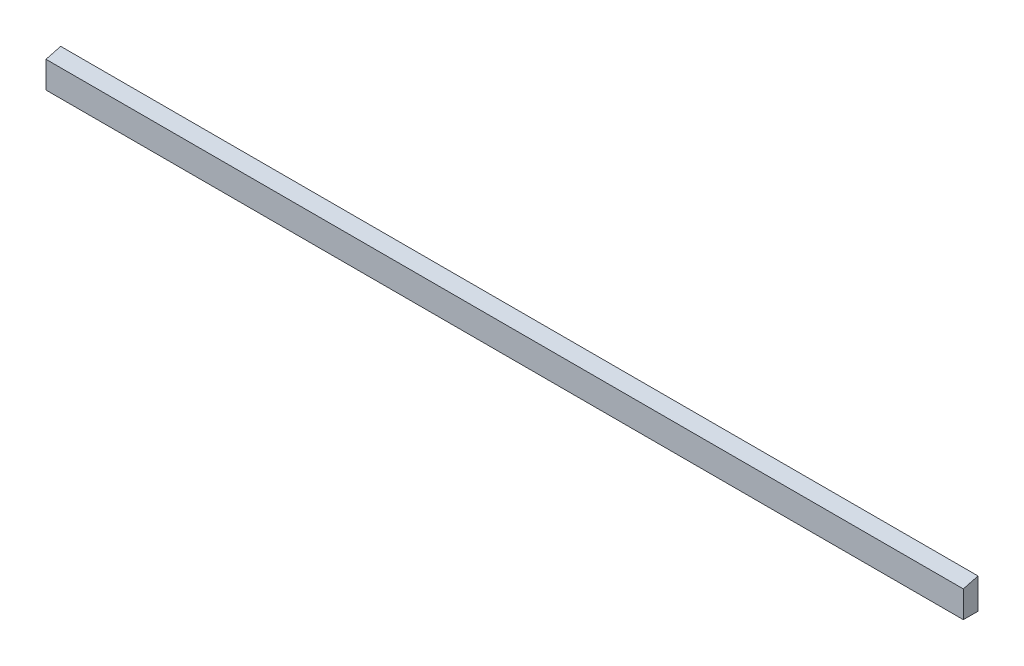
ISO-10303-21;
HEADER;
FILE_DESCRIPTION(('STEP AP214'),'2;1');
FILE_NAME('part.step','',(''),(''),'','','');
FILE_SCHEMA(('AUTOMOTIVE_DESIGN { 1 0 10303 214 1 1 1 1 }'));
ENDSEC;
DATA;
#1=APPLICATION_CONTEXT('core data for automotive mechanical design processes');
#2=APPLICATION_PROTOCOL_DEFINITION('international standard','automotive_design',2000,#1);
#3=PRODUCT_CONTEXT('',#1,'mechanical');
#4=PRODUCT('Part','Part','',(#3));
#5=PRODUCT_RELATED_PRODUCT_CATEGORY('part','',(#4));
#6=PRODUCT_DEFINITION_FORMATION('','',#4);
#7=PRODUCT_DEFINITION_CONTEXT('part definition',#1,'design');
#8=PRODUCT_DEFINITION('design','',#6,#7);
#9=PRODUCT_DEFINITION_SHAPE('','',#8);
#10=(LENGTH_UNIT() NAMED_UNIT(*) SI_UNIT(.MILLI.,.METRE.));
#11=(NAMED_UNIT(*) PLANE_ANGLE_UNIT() SI_UNIT($,.RADIAN.));
#12=(NAMED_UNIT(*) SI_UNIT($,.STERADIAN.) SOLID_ANGLE_UNIT());
#13=UNCERTAINTY_MEASURE_WITH_UNIT(LENGTH_MEASURE(1.E-05),#10,'distance_accuracy_value','');
#14=(GEOMETRIC_REPRESENTATION_CONTEXT(3) GLOBAL_UNCERTAINTY_ASSIGNED_CONTEXT((#13)) GLOBAL_UNIT_ASSIGNED_CONTEXT((#10,
#11,#12)) REPRESENTATION_CONTEXT('',''));
#15=CARTESIAN_POINT('',(0.,0.,0.));
#16=DIRECTION('',(0.,0.,1.));
#17=DIRECTION('',(1.,0.,0.));
#18=AXIS2_PLACEMENT_3D('',#15,#16,#17);
#19=CARTESIAN_POINT('',(1143.,38.1,0.));
#20=DIRECTION('',(0.,0.,1.));
#21=DIRECTION('',(0.,-1.,0.));
#22=AXIS2_PLACEMENT_3D('',#19,#20,#21);
#23=PLANE('',#22);
#24=DIRECTION('',(0.,1.,0.));
#25=VECTOR('',#24,1.);
#26=CARTESIAN_POINT('',(0.,38.1,0.));
#27=LINE('',#26,#25);
#28=CARTESIAN_POINT('',(0.,0.,0.));
#29=VERTEX_POINT('',#28);
#30=CARTESIAN_POINT('',(0.,38.1,0.));
#31=VERTEX_POINT('',#30);
#32=EDGE_CURVE('E93',#29,#31,#27,.T.);
#33=ORIENTED_EDGE('',*,*,#32,.T.);
#34=DIRECTION('',(-1.,0.,0.));
#35=VECTOR('',#34,1.);
#36=CARTESIAN_POINT('',(1143.,38.1,0.));
#37=LINE('',#36,#35);
#38=CARTESIAN_POINT('',(1143.,38.1,0.));
#39=VERTEX_POINT('',#38);
#40=EDGE_CURVE('E11',#39,#31,#37,.T.);
#41=ORIENTED_EDGE('',*,*,#40,.F.);
#42=DIRECTION('',(0.,1.,0.));
#43=VECTOR('',#42,1.);
#44=CARTESIAN_POINT('',(1143.,38.1,0.));
#45=LINE('',#44,#43);
#46=CARTESIAN_POINT('',(1143.,0.,0.));
#47=VERTEX_POINT('',#46);
#48=EDGE_CURVE('E81',#47,#39,#45,.T.);
#49=ORIENTED_EDGE('',*,*,#48,.F.);
#50=DIRECTION('',(-1.,0.,0.));
#51=VECTOR('',#50,1.);
#52=CARTESIAN_POINT('',(1143.,0.,0.));
#53=LINE('',#52,#51);
#54=EDGE_CURVE('E89',#47,#29,#53,.T.);
#55=ORIENTED_EDGE('',*,*,#54,.T.);
#56=EDGE_LOOP('',(#33,#41,#49,#55));
#57=FACE_BOUND('',#56,.T.);
#58=ADVANCED_FACE('F30',(#57),#23,.F.);
#59=CARTESIAN_POINT('',(1143.,33.2082525556792,18.25625));
#60=DIRECTION('',(0.,-0.965925826289067,-0.258819045102525));
#61=DIRECTION('',(0.,0.258819045102525,-0.965925826289067));
#62=AXIS2_PLACEMENT_3D('',#59,#60,#61);
#63=PLANE('',#62);
#64=DIRECTION('',(0.,-0.258819045102525,0.965925826289067));
#65=VECTOR('',#64,1.);
#66=CARTESIAN_POINT('',(0.,33.2082525556792,18.2562499999998));
#67=LINE('',#66,#65);
#68=CARTESIAN_POINT('',(0.,33.2082525556792,18.2562499999998));
#69=VERTEX_POINT('',#68);
#70=EDGE_CURVE('E85',#31,#69,#67,.T.);
#71=ORIENTED_EDGE('',*,*,#70,.T.);
#72=DIRECTION('',(-1.,0.,0.));
#73=VECTOR('',#72,1.);
#74=CARTESIAN_POINT('',(1143.,33.2082525556792,18.25625));
#75=LINE('',#74,#73);
#76=CARTESIAN_POINT('',(1143.,33.2082525556792,18.25625));
#77=VERTEX_POINT('',#76);
#78=EDGE_CURVE('E38',#77,#69,#75,.T.);
#79=ORIENTED_EDGE('',*,*,#78,.F.);
#80=DIRECTION('',(0.,-0.258819045102525,0.965925826289067));
#81=VECTOR('',#80,1.);
#82=CARTESIAN_POINT('',(1143.,33.2082525556792,18.25625));
#83=LINE('',#82,#81);
#84=EDGE_CURVE('E76',#39,#77,#83,.T.);
#85=ORIENTED_EDGE('',*,*,#84,.F.);
#86=ORIENTED_EDGE('',*,*,#40,.T.);
#87=EDGE_LOOP('',(#71,#79,#85,#86));
#88=FACE_BOUND('',#87,.T.);
#89=ADVANCED_FACE('F84',(#88),#63,.F.);
#90=CARTESIAN_POINT('',(1143.,0.,18.2562499999998));
#91=DIRECTION('',(0.,0.,-1.));
#92=DIRECTION('',(-1.,0.,0.));
#93=AXIS2_PLACEMENT_3D('',#90,#91,#92);
#94=PLANE('',#93);
#95=DIRECTION('',(0.,-1.,0.));
#96=VECTOR('',#95,1.);
#97=CARTESIAN_POINT('',(0.,0.,18.2562499999997));
#98=LINE('',#97,#96);
#99=CARTESIAN_POINT('',(0.,0.,18.2562499999997));
#100=VERTEX_POINT('',#99);
#101=EDGE_CURVE('E63',#69,#100,#98,.T.);
#102=ORIENTED_EDGE('',*,*,#101,.T.);
#103=DIRECTION('',(-1.,0.,0.));
#104=VECTOR('',#103,1.);
#105=CARTESIAN_POINT('',(1143.,0.,18.2562499999998));
#106=LINE('',#105,#104);
#107=CARTESIAN_POINT('',(1143.,0.,18.2562499999998));
#108=VERTEX_POINT('',#107);
#109=EDGE_CURVE('E86',#108,#100,#106,.T.);
#110=ORIENTED_EDGE('',*,*,#109,.F.);
#111=DIRECTION('',(0.,-1.,0.));
#112=VECTOR('',#111,1.);
#113=CARTESIAN_POINT('',(1143.,0.,18.2562499999998));
#114=LINE('',#113,#112);
#115=EDGE_CURVE('E79',#77,#108,#114,.T.);
#116=ORIENTED_EDGE('',*,*,#115,.F.);
#117=ORIENTED_EDGE('',*,*,#78,.T.);
#118=EDGE_LOOP('',(#102,#110,#116,#117));
#119=FACE_BOUND('',#118,.T.);
#120=ADVANCED_FACE('F87',(#119),#94,.F.);
#121=CARTESIAN_POINT('',(1143.,0.,0.));
#122=DIRECTION('',(0.,1.,0.));
#123=DIRECTION('',(0.,0.,1.));
#124=AXIS2_PLACEMENT_3D('',#121,#122,#123);
#125=PLANE('',#124);
#126=DIRECTION('',(0.,0.,-1.));
#127=VECTOR('',#126,1.);
#128=CARTESIAN_POINT('',(0.,0.,0.));
#129=LINE('',#128,#127);
#130=EDGE_CURVE('E69',#100,#29,#129,.T.);
#131=ORIENTED_EDGE('',*,*,#130,.T.);
#132=ORIENTED_EDGE('',*,*,#54,.F.);
#133=DIRECTION('',(0.,0.,-1.));
#134=VECTOR('',#133,1.);
#135=CARTESIAN_POINT('',(1143.,0.,0.));
#136=LINE('',#135,#134);
#137=EDGE_CURVE('E46',#108,#47,#136,.T.);
#138=ORIENTED_EDGE('',*,*,#137,.F.);
#139=ORIENTED_EDGE('',*,*,#109,.T.);
#140=EDGE_LOOP('',(#131,#132,#138,#139));
#141=FACE_BOUND('',#140,.T.);
#142=ADVANCED_FACE('F100',(#141),#125,.F.);
#143=CARTESIAN_POINT('',(1143.,0.,0.));
#144=DIRECTION('',(-1.,0.,0.));
#145=DIRECTION('',(0.,0.,1.));
#146=AXIS2_PLACEMENT_3D('',#143,#144,#145);
#147=PLANE('',#146);
#148=ORIENTED_EDGE('',*,*,#48,.T.);
#149=ORIENTED_EDGE('',*,*,#84,.T.);
#150=ORIENTED_EDGE('',*,*,#115,.T.);
#151=ORIENTED_EDGE('',*,*,#137,.T.);
#152=EDGE_LOOP('',(#148,#149,#150,#151));
#153=FACE_BOUND('',#152,.T.);
#154=ADVANCED_FACE('F77',(#153),#147,.F.);
#155=CARTESIAN_POINT('',(0.,0.,0.));
#156=DIRECTION('',(-1.,0.,0.));
#157=DIRECTION('',(0.,0.,1.));
#158=AXIS2_PLACEMENT_3D('',#155,#156,#157);
#159=PLANE('',#158);
#160=ORIENTED_EDGE('',*,*,#32,.F.);
#161=ORIENTED_EDGE('',*,*,#130,.F.);
#162=ORIENTED_EDGE('',*,*,#101,.F.);
#163=ORIENTED_EDGE('',*,*,#70,.F.);
#164=EDGE_LOOP('',(#160,#161,#162,#163));
#165=FACE_BOUND('',#164,.T.);
#166=ADVANCED_FACE('F103',(#165),#159,.T.);
#167=CLOSED_SHELL('',(#58,#89,#120,#142,#154,#166));
#168=MANIFOLD_SOLID_BREP('B2',#167);
#169=ADVANCED_BREP_SHAPE_REPRESENTATION('',(#18,#168),#14);
#170=SHAPE_DEFINITION_REPRESENTATION(#9,#169);
ENDSEC;
END-ISO-10303-21;
